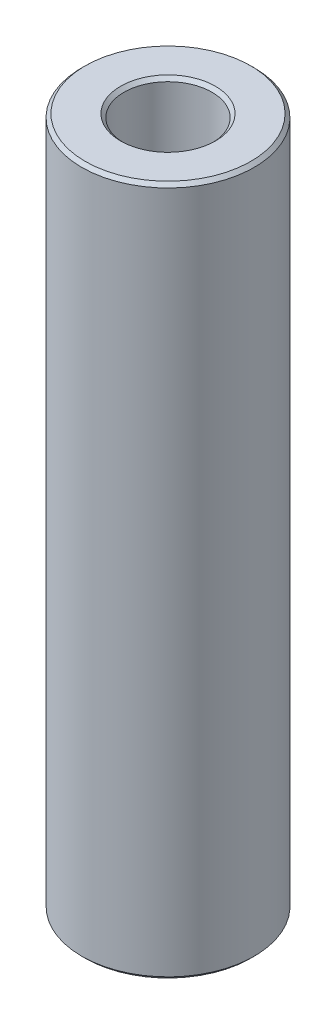
ISO-10303-21;
HEADER;
FILE_DESCRIPTION(('STEP AP214'),'2;1');
FILE_NAME('part.step','',(''),(''),'','','');
FILE_SCHEMA(('AUTOMOTIVE_DESIGN { 1 0 10303 214 1 1 1 1 }'));
ENDSEC;
DATA;
#1=APPLICATION_CONTEXT('core data for automotive mechanical design processes');
#2=APPLICATION_PROTOCOL_DEFINITION('international standard','automotive_design',2000,#1);
#3=PRODUCT_CONTEXT('',#1,'mechanical');
#4=PRODUCT('Part','Part','',(#3));
#5=PRODUCT_RELATED_PRODUCT_CATEGORY('part','',(#4));
#6=PRODUCT_DEFINITION_FORMATION('','',#4);
#7=PRODUCT_DEFINITION_CONTEXT('part definition',#1,'design');
#8=PRODUCT_DEFINITION('design','',#6,#7);
#9=PRODUCT_DEFINITION_SHAPE('','',#8);
#10=(LENGTH_UNIT() NAMED_UNIT(*) SI_UNIT(.MILLI.,.METRE.));
#11=(NAMED_UNIT(*) PLANE_ANGLE_UNIT() SI_UNIT($,.RADIAN.));
#12=(NAMED_UNIT(*) SI_UNIT($,.STERADIAN.) SOLID_ANGLE_UNIT());
#13=UNCERTAINTY_MEASURE_WITH_UNIT(LENGTH_MEASURE(1.E-05),#10,'distance_accuracy_value','');
#14=(GEOMETRIC_REPRESENTATION_CONTEXT(3) GLOBAL_UNCERTAINTY_ASSIGNED_CONTEXT((#13)) GLOBAL_UNIT_ASSIGNED_CONTEXT((#10,
#11,#12)) REPRESENTATION_CONTEXT('',''));
#15=CARTESIAN_POINT('',(0.,0.,0.));
#16=DIRECTION('',(0.,0.,1.));
#17=DIRECTION('',(1.,0.,0.));
#18=AXIS2_PLACEMENT_3D('',#15,#16,#17);
#19=CARTESIAN_POINT('',(0.,20.,-2.75));
#20=DIRECTION('',(0.,-1.,0.));
#21=DIRECTION('',(0.,0.,-1.));
#22=AXIS2_PLACEMENT_3D('',#19,#20,#21);
#23=PLANE('',#22);
#24=CARTESIAN_POINT('',(0.,20.,0.));
#25=DIRECTION('',(0.,1.,0.));
#26=DIRECTION('',(0.,0.,1.));
#27=AXIS2_PLACEMENT_3D('',#24,#25,#26);
#28=CIRCLE('',#27,2.75);
#29=CARTESIAN_POINT('',(0.,20.,2.75));
#30=VERTEX_POINT('',#29);
#31=EDGE_CURVE('E67',#30,#30,#28,.T.);
#32=ORIENTED_EDGE('',*,*,#31,.F.);
#33=EDGE_LOOP('',(#32));
#34=FACE_BOUND('',#33,.T.);
#35=CARTESIAN_POINT('',(0.,20.,0.));
#36=DIRECTION('',(0.,1.,0.));
#37=DIRECTION('',(0.,0.,1.));
#38=AXIS2_PLACEMENT_3D('',#35,#36,#37);
#39=CIRCLE('',#38,4.8);
#40=CARTESIAN_POINT('',(0.,20.,4.8));
#41=VERTEX_POINT('',#40);
#42=EDGE_CURVE('E10',#41,#41,#39,.T.);
#43=ORIENTED_EDGE('',*,*,#42,.T.);
#44=EDGE_LOOP('',(#43));
#45=FACE_BOUND('',#44,.T.);
#46=ADVANCED_FACE('F39',(#34,#45),#23,.F.);
#47=CARTESIAN_POINT('',(0.,19.8,0.));
#48=DIRECTION('',(0.,-1.,0.));
#49=DIRECTION('',(0.,0.,-1.));
#50=AXIS2_PLACEMENT_3D('',#47,#48,#49);
#51=CONICAL_SURFACE('',#50,5.,0.78539816339745);
#52=ORIENTED_EDGE('',*,*,#42,.F.);
#53=EDGE_LOOP('',(#52));
#54=FACE_BOUND('',#53,.T.);
#55=CARTESIAN_POINT('',(0.,19.8,0.));
#56=DIRECTION('',(0.,1.,0.));
#57=DIRECTION('',(0.,0.,1.));
#58=AXIS2_PLACEMENT_3D('',#55,#56,#57);
#59=CIRCLE('',#58,5.);
#60=CARTESIAN_POINT('',(0.,19.8,5.));
#61=VERTEX_POINT('',#60);
#62=EDGE_CURVE('E45',#61,#61,#59,.T.);
#63=ORIENTED_EDGE('',*,*,#62,.T.);
#64=EDGE_LOOP('',(#63));
#65=FACE_BOUND('',#64,.T.);
#66=ADVANCED_FACE('F74',(#54,#65),#51,.T.);
#67=CARTESIAN_POINT('',(0.,2.13387096774193,0.));
#68=DIRECTION('',(0.,1.,0.));
#69=DIRECTION('',(0.,0.,1.));
#70=AXIS2_PLACEMENT_3D('',#67,#68,#69);
#71=CYLINDRICAL_SURFACE('',#70,5.);
#72=ORIENTED_EDGE('',*,*,#62,.F.);
#73=EDGE_LOOP('',(#72));
#74=FACE_BOUND('',#73,.T.);
#75=CARTESIAN_POINT('',(0.,-19.8,0.));
#76=DIRECTION('',(0.,1.,0.));
#77=DIRECTION('',(0.,0.,1.));
#78=AXIS2_PLACEMENT_3D('',#75,#76,#77);
#79=CIRCLE('',#78,5.);
#80=CARTESIAN_POINT('',(0.,-19.8,5.));
#81=VERTEX_POINT('',#80);
#82=EDGE_CURVE('E49',#81,#81,#79,.T.);
#83=ORIENTED_EDGE('',*,*,#82,.T.);
#84=EDGE_LOOP('',(#83));
#85=FACE_BOUND('',#84,.T.);
#86=ADVANCED_FACE('F78',(#74,#85),#71,.T.);
#87=CARTESIAN_POINT('',(0.,-20.,0.));
#88=DIRECTION('',(0.,1.,0.));
#89=DIRECTION('',(0.,0.,1.));
#90=AXIS2_PLACEMENT_3D('',#87,#88,#89);
#91=CONICAL_SURFACE('',#90,4.8,0.785398163397468);
#92=ORIENTED_EDGE('',*,*,#82,.F.);
#93=EDGE_LOOP('',(#92));
#94=FACE_BOUND('',#93,.T.);
#95=CARTESIAN_POINT('',(0.,-20.,0.));
#96=DIRECTION('',(0.,1.,0.));
#97=DIRECTION('',(0.,0.,1.));
#98=AXIS2_PLACEMENT_3D('',#95,#96,#97);
#99=CIRCLE('',#98,4.8);
#100=CARTESIAN_POINT('',(0.,-20.,4.8));
#101=VERTEX_POINT('',#100);
#102=EDGE_CURVE('E53',#101,#101,#99,.T.);
#103=ORIENTED_EDGE('',*,*,#102,.T.);
#104=EDGE_LOOP('',(#103));
#105=FACE_BOUND('',#104,.T.);
#106=ADVANCED_FACE('F83',(#94,#105),#91,.T.);
#107=CARTESIAN_POINT('',(0.,-20.,-2.75));
#108=DIRECTION('',(0.,1.,0.));
#109=DIRECTION('',(0.,0.,1.));
#110=AXIS2_PLACEMENT_3D('',#107,#108,#109);
#111=PLANE('',#110);
#112=ORIENTED_EDGE('',*,*,#102,.F.);
#113=EDGE_LOOP('',(#112));
#114=FACE_BOUND('',#113,.T.);
#115=CARTESIAN_POINT('',(0.,-20.,0.));
#116=DIRECTION('',(0.,1.,0.));
#117=DIRECTION('',(0.,0.,1.));
#118=AXIS2_PLACEMENT_3D('',#115,#116,#117);
#119=CIRCLE('',#118,2.75);
#120=CARTESIAN_POINT('',(0.,-20.,2.75));
#121=VERTEX_POINT('',#120);
#122=EDGE_CURVE('E58',#121,#121,#119,.T.);
#123=ORIENTED_EDGE('',*,*,#122,.T.);
#124=EDGE_LOOP('',(#123));
#125=FACE_BOUND('',#124,.T.);
#126=ADVANCED_FACE('F89',(#114,#125),#111,.F.);
#127=CARTESIAN_POINT('',(0.,-19.8,0.));
#128=DIRECTION('',(0.,-1.,0.));
#129=DIRECTION('',(0.,0.,-1.));
#130=AXIS2_PLACEMENT_3D('',#127,#128,#129);
#131=CONICAL_SURFACE('',#130,2.55,0.78539816339747);
#132=ORIENTED_EDGE('',*,*,#122,.F.);
#133=EDGE_LOOP('',(#132));
#134=FACE_BOUND('',#133,.T.);
#135=CARTESIAN_POINT('',(0.,-19.8,0.));
#136=DIRECTION('',(0.,1.,0.));
#137=DIRECTION('',(0.,0.,1.));
#138=AXIS2_PLACEMENT_3D('',#135,#136,#137);
#139=CIRCLE('',#138,2.55);
#140=CARTESIAN_POINT('',(0.,-19.8,2.55));
#141=VERTEX_POINT('',#140);
#142=EDGE_CURVE('E61',#141,#141,#139,.T.);
#143=ORIENTED_EDGE('',*,*,#142,.T.);
#144=EDGE_LOOP('',(#143));
#145=FACE_BOUND('',#144,.T.);
#146=ADVANCED_FACE('F93',(#134,#145),#131,.F.);
#147=CARTESIAN_POINT('',(0.,2.13387096774193,0.));
#148=DIRECTION('',(0.,1.,0.));
#149=DIRECTION('',(0.,0.,1.));
#150=AXIS2_PLACEMENT_3D('',#147,#148,#149);
#151=CYLINDRICAL_SURFACE('',#150,2.55);
#152=ORIENTED_EDGE('',*,*,#142,.F.);
#153=EDGE_LOOP('',(#152));
#154=FACE_BOUND('',#153,.T.);
#155=CARTESIAN_POINT('',(0.,19.8,0.));
#156=DIRECTION('',(0.,1.,0.));
#157=DIRECTION('',(0.,0.,1.));
#158=AXIS2_PLACEMENT_3D('',#155,#156,#157);
#159=CIRCLE('',#158,2.55);
#160=CARTESIAN_POINT('',(0.,19.8,2.55));
#161=VERTEX_POINT('',#160);
#162=EDGE_CURVE('E64',#161,#161,#159,.T.);
#163=ORIENTED_EDGE('',*,*,#162,.T.);
#164=EDGE_LOOP('',(#163));
#165=FACE_BOUND('',#164,.T.);
#166=ADVANCED_FACE('F97',(#154,#165),#151,.F.);
#167=CARTESIAN_POINT('',(0.,20.,0.));
#168=DIRECTION('',(0.,1.,0.));
#169=DIRECTION('',(0.,0.,1.));
#170=AXIS2_PLACEMENT_3D('',#167,#168,#169);
#171=CONICAL_SURFACE('',#170,2.75,0.785398163397468);
#172=ORIENTED_EDGE('',*,*,#162,.F.);
#173=EDGE_LOOP('',(#172));
#174=FACE_BOUND('',#173,.T.);
#175=ORIENTED_EDGE('',*,*,#31,.T.);
#176=EDGE_LOOP('',(#175));
#177=FACE_BOUND('',#176,.T.);
#178=ADVANCED_FACE('F71',(#174,#177),#171,.F.);
#179=CLOSED_SHELL('',(#46,#66,#86,#106,#126,#146,#166,#178));
#180=MANIFOLD_SOLID_BREP('B2',#179);
#181=ADVANCED_BREP_SHAPE_REPRESENTATION('',(#18,#180),#14);
#182=SHAPE_DEFINITION_REPRESENTATION(#9,#181);
ENDSEC;
END-ISO-10303-21;
